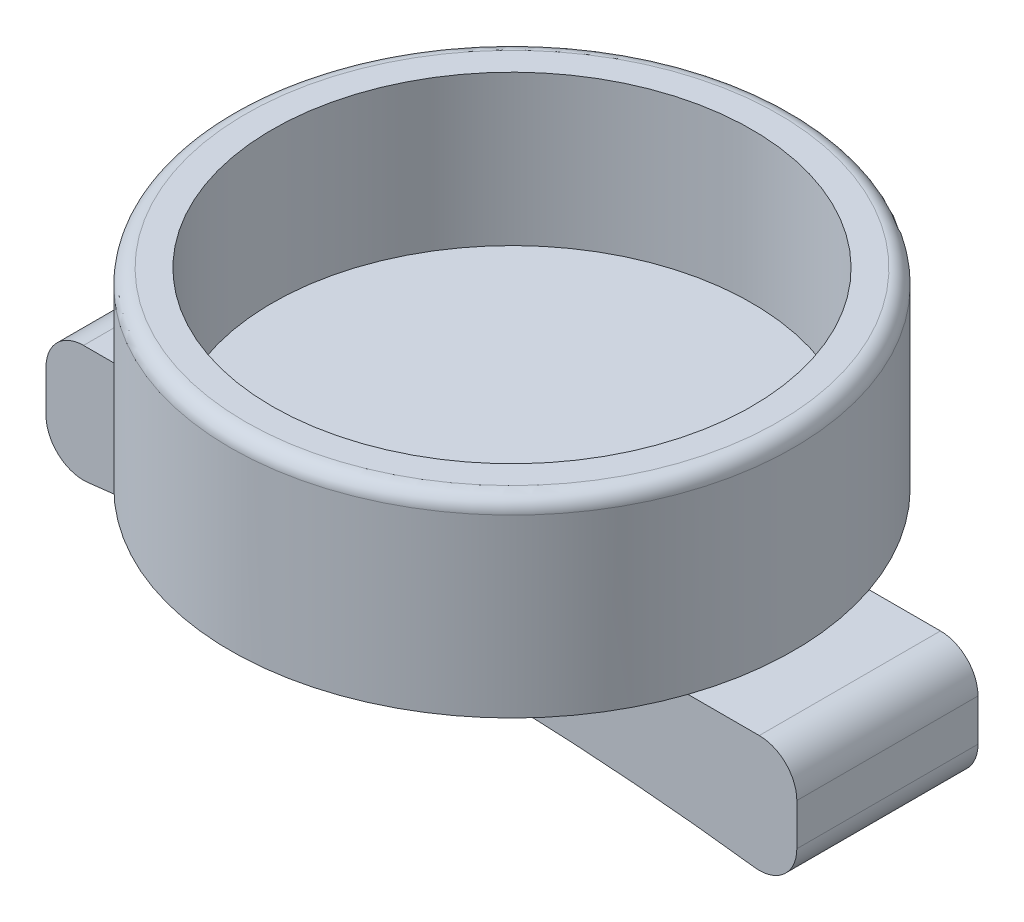
ISO-10303-21;
HEADER;
FILE_DESCRIPTION(('STEP AP214'),'2;1');
FILE_NAME('part.step','',(''),(''),'','','');
FILE_SCHEMA(('AUTOMOTIVE_DESIGN { 1 0 10303 214 1 1 1 1 }'));
ENDSEC;
DATA;
#1=APPLICATION_CONTEXT('core data for automotive mechanical design processes');
#2=APPLICATION_PROTOCOL_DEFINITION('international standard','automotive_design',2000,#1);
#3=PRODUCT_CONTEXT('',#1,'mechanical');
#4=PRODUCT('Part','Part','',(#3));
#5=PRODUCT_RELATED_PRODUCT_CATEGORY('part','',(#4));
#6=PRODUCT_DEFINITION_FORMATION('','',#4);
#7=PRODUCT_DEFINITION_CONTEXT('part definition',#1,'design');
#8=PRODUCT_DEFINITION('design','',#6,#7);
#9=PRODUCT_DEFINITION_SHAPE('','',#8);
#10=(LENGTH_UNIT() NAMED_UNIT(*) SI_UNIT(.MILLI.,.METRE.));
#11=(NAMED_UNIT(*) PLANE_ANGLE_UNIT() SI_UNIT($,.RADIAN.));
#12=(NAMED_UNIT(*) SI_UNIT($,.STERADIAN.) SOLID_ANGLE_UNIT());
#13=UNCERTAINTY_MEASURE_WITH_UNIT(LENGTH_MEASURE(1.E-05),#10,'distance_accuracy_value','');
#14=(GEOMETRIC_REPRESENTATION_CONTEXT(3) GLOBAL_UNCERTAINTY_ASSIGNED_CONTEXT((#13)) GLOBAL_UNIT_ASSIGNED_CONTEXT((#10,
#11,#12)) REPRESENTATION_CONTEXT('',''));
#15=CARTESIAN_POINT('',(0.,0.,0.));
#16=DIRECTION('',(0.,0.,1.));
#17=DIRECTION('',(1.,0.,0.));
#18=AXIS2_PLACEMENT_3D('',#15,#16,#17);
#19=CARTESIAN_POINT('',(0.,0.,2.413));
#20=DIRECTION('',(0.,0.,-1.));
#21=DIRECTION('',(-1.,0.,0.));
#22=AXIS2_PLACEMENT_3D('',#19,#20,#21);
#23=PLANE('',#22);
#24=CARTESIAN_POINT('',(-22.7137334488737,2.90967048638995,2.413));
#25=CARTESIAN_POINT('',(-21.755931286614,2.58714199098328,2.413));
#26=CARTESIAN_POINT('',(-20.7980778462307,2.26476496124619,2.413));
#27=CARTESIAN_POINT('',(-18.8792538706622,1.61965706366946,2.413));
#28=CARTESIAN_POINT('',(-17.9182826982644,1.29692809151747,2.413));
#29=CARTESIAN_POINT('',(-16.4437736747863,0.802546202921666,2.413));
#30=CARTESIAN_POINT('',(-15.9303498034586,0.630553417674674,2.413));
#31=CARTESIAN_POINT('',(-14.9033719246389,0.286932511774781,2.413));
#32=CARTESIAN_POINT('',(-14.3898179154052,0.115304396326443,2.413));
#33=CARTESIAN_POINT('',(-13.364155220285,-0.226917721989866,2.413));
#34=CARTESIAN_POINT('',(-12.8520470534466,-0.397513279934092,2.413));
#35=CARTESIAN_POINT('',(-11.827627104193,-0.738002495666409,2.413));
#36=CARTESIAN_POINT('',(-11.3153153338468,-0.907896189748109,2.413));
#37=CARTESIAN_POINT('',(-10.338599279968,-1.23072301561994,2.413));
#38=CARTESIAN_POINT('',(-9.87422512189183,-1.38374720389446,2.413));
#39=CARTESIAN_POINT('',(-8.94498208032934,-1.68858753628638,2.413));
#40=CARTESIAN_POINT('',(-8.48011311932927,-1.84040344423641,2.413));
#41=CARTESIAN_POINT('',(-7.54527677082481,-2.14357314596044,2.413));
#42=CARTESIAN_POINT('',(-7.07530336109038,-2.29490844130505,2.413));
#43=CARTESIAN_POINT('',(-6.369710028631,-2.51934930484679,2.413));
#44=CARTESIAN_POINT('',(-6.13448977949526,-2.59371013970404,2.413));
#45=CARTESIAN_POINT('',(-5.66369115748972,-2.74128805393398,2.413));
#46=CARTESIAN_POINT('',(-5.42811278609452,-2.81450513800222,2.413));
#47=CARTESIAN_POINT('',(-4.96686623918096,-2.95616436490684,2.413));
#48=CARTESIAN_POINT('',(-4.7412190630461,-3.02467470731523,2.413));
#49=CARTESIAN_POINT('',(-4.28931766296279,-3.1596552992677,2.413));
#50=CARTESIAN_POINT('',(-4.06306344975769,-3.22612558466109,2.413));
#51=CARTESIAN_POINT('',(-3.60902358989221,-3.35629130829126,2.413));
#52=CARTESIAN_POINT('',(-3.38123539011639,-3.41997791001711,2.413));
#53=CARTESIAN_POINT('',(-2.92441048730306,-3.54284143497381,2.413));
#54=CARTESIAN_POINT('',(-2.69537364971259,-3.60201786146824,2.413));
#55=CARTESIAN_POINT('',(-2.24005749159687,-3.71223133839901,2.413));
#56=CARTESIAN_POINT('',(-2.01381232453697,-3.76340538727789,2.413));
#57=CARTESIAN_POINT('',(-1.67280216760501,-3.8321080359036,2.413));
#58=CARTESIAN_POINT('',(-1.55885359035779,-3.85366657965055,2.413));
#59=CARTESIAN_POINT('',(-1.33036007146013,-3.89341751441553,2.413));
#60=CARTESIAN_POINT('',(-1.21581511404295,-3.91160981596948,2.413));
#61=CARTESIAN_POINT('',(-0.986888545797888,-3.94379052992712,2.413));
#62=CARTESIAN_POINT('',(-0.872510731079832,-3.95780555379537,2.413));
#63=CARTESIAN_POINT('',(-0.643279310200802,-3.98106674776154,2.413));
#64=CARTESIAN_POINT('',(-0.528425778128833,-3.99031363424318,2.413));
#65=CARTESIAN_POINT('',(-0.298482448574701,-4.00346240854396,2.413));
#66=CARTESIAN_POINT('',(-0.183392856714842,-4.00736781531629,2.413));
#67=CARTESIAN_POINT('',(0.046840066937026,-4.0095727133296,2.413));
#68=CARTESIAN_POINT('',(0.16198339812148,-4.00787226648322,2.413));
#69=CARTESIAN_POINT('',(0.389382945835056,-3.99909037228484,2.413));
#70=CARTESIAN_POINT('',(0.501644137690981,-3.99213474825159,2.413));
#71=CARTESIAN_POINT('',(0.725761030007553,-3.97342768470354,2.413));
#72=CARTESIAN_POINT('',(0.837616715553378,-3.96167607055847,2.413));
#73=CARTESIAN_POINT('',(1.17257762731816,-3.92015316079864,2.413));
#74=CARTESIAN_POINT('',(1.39490402853282,-3.8841222324034,2.413));
#75=CARTESIAN_POINT('',(1.83889791317842,-3.80046790514408,2.413));
#76=CARTESIAN_POINT('',(2.0605492235629,-3.75276318574789,2.413));
#77=CARTESIAN_POINT('',(2.50203848654343,-3.65003415340485,2.413));
#78=CARTESIAN_POINT('',(2.72187705136155,-3.5950124290053,2.413));
#79=CARTESIAN_POINT('',(3.16492025670042,-3.47901001963116,2.413));
#80=CARTESIAN_POINT('',(3.38809801795814,-3.41792807888983,2.413));
#81=CARTESIAN_POINT('',(3.83353905625117,-3.29249665439287,2.413));
#82=CARTESIAN_POINT('',(4.05580228758636,-3.22814700943946,2.413));
#83=CARTESIAN_POINT('',(4.49896139574724,-3.09742462557166,2.413));
#84=CARTESIAN_POINT('',(4.71985937306286,-3.03105897514001,2.413));
#85=CARTESIAN_POINT('',(5.16117262290718,-2.89676134874545,2.413));
#86=CARTESIAN_POINT('',(5.38158790487693,-2.82882940372282,2.413));
#87=CARTESIAN_POINT('',(5.83207718800281,-2.68871015685732,2.413));
#88=CARTESIAN_POINT('',(6.06213466218612,-2.61646981386599,2.413));
#89=CARTESIAN_POINT('',(6.52195810111018,-2.47106650431598,2.413));
#90=CARTESIAN_POINT('',(6.75172406508084,-2.3979035353255,2.413));
#91=CARTESIAN_POINT('',(7.44107226429194,-2.1772597056358,2.413));
#92=CARTESIAN_POINT('',(7.90032292451107,-2.0287436324766,2.413));
#93=CARTESIAN_POINT('',(8.81412510199966,-1.731400007019,2.413));
#94=CARTESIAN_POINT('',(9.26868151462657,-1.5825874524721,2.413));
#95=CARTESIAN_POINT('',(10.1774397803836,-1.28388202990367,2.413));
#96=CARTESIAN_POINT('',(10.6316416330151,-1.1339891603659,2.413));
#97=CARTESIAN_POINT('',(11.5850138140841,-0.818500585026312,2.413));
#98=CARTESIAN_POINT('',(12.0841584987104,-0.652827448838141,2.413));
#99=CARTESIAN_POINT('',(13.0822716727033,-0.320846760472825,2.413));
#100=CARTESIAN_POINT('',(13.5812401489903,-0.154539168990076,2.413));
#101=CARTESIAN_POINT('',(15.0808537911729,0.346026634625419,2.413));
#102=CARTESIAN_POINT('',(16.081275203279,0.680954991612116,2.413));
#103=CARTESIAN_POINT('',(18.0218015070006,1.33169069993779,2.413));
#104=CARTESIAN_POINT('',(18.9619258017048,1.64744024995831,2.413));
#105=CARTESIAN_POINT('',(20.8392949278039,2.27863285250425,2.413));
#106=CARTESIAN_POINT('',(21.7765403279972,2.59407421296093,2.413));
#107=CARTESIAN_POINT('',(22.7137334488737,2.90967048638995,2.413));
#108=B_SPLINE_CURVE_WITH_KNOTS('',3,(#24,#25,#26,#27,#28,#29,#30,#31,#32,#33,#34,#35,#36,#37,
#38,#39,#40,#41,#42,#43,#44,#45,#46,#47,#48,#49,#50,#51,#52,#53,#54,#55,#56,#57,#58,#59,#60,#61,
#62,#63,#64,#65,#66,#67,#68,#69,#70,#71,#72,#73,#74,#75,#76,#77,#78,#79,#80,#81,#82,#83,#84,#85,
#86,#87,#88,#89,#90,#91,#92,#93,#94,#95,#96,#97,#98,#99,#100,#101,#102,#103,#104,#105,#106,
#107),.UNSPECIFIED.,.F.,.F.,(4,2,2,2,2,2,2,2,2,2,2,2,2,2,2,2,2,2,2,2,2,2,2,2,2,2,2,2,2,2,2,2,2,
2,2,2,2,2,2,2,2,4),(0.,3.03194475618864,6.07309165187313,7.69748999329384,9.3219113644464,
10.9412376015683,12.560479027533,14.0272898892828,15.4943807363948,16.9755863759592,
17.7156673831237,18.4557453511755,19.1631937923228,19.8706297945631,20.5801688651187,
21.2897859694714,21.9854701968495,22.3333413523373,22.6812217518131,23.0268361223902,
23.3723985513639,23.7177332148565,24.0630640643867,24.400378883023,24.7377059849689,
25.4128773510045,26.0928930381366,26.7726687919698,27.4667911638684,28.1609478105586,
28.8528958078494,29.5448301482214,30.2682264587064,30.9916246762735,32.4396217050809,
33.8745071083458,35.309394525884,36.8871572737112,38.4650194076143,41.6300111513782,
44.6052056503395,47.5719190303954),.UNSPECIFIED.);
#109=CARTESIAN_POINT('',(-7.10122742911393,-2.286,2.413));
#110=VERTEX_POINT('',#109);
#111=CARTESIAN_POINT('',(7.10122742911393,-2.286,2.413));
#112=VERTEX_POINT('',#111);
#113=EDGE_CURVE('E61',#110,#112,#108,.T.);
#114=ORIENTED_EDGE('',*,*,#113,.F.);
#115=DIRECTION('',(1.,0.,0.));
#116=VECTOR('',#115,1.);
#117=CARTESIAN_POINT('',(0.,-2.286,2.413));
#118=LINE('',#117,#116);
#119=CARTESIAN_POINT('',(-8.99999918825691,-2.286,2.413));
#120=VERTEX_POINT('',#119);
#121=EDGE_CURVE('E127',#120,#110,#118,.T.);
#122=ORIENTED_EDGE('',*,*,#121,.F.);
#123=CARTESIAN_POINT('',(-8.99999918825692,-3.286,2.413));
#124=DIRECTION('',(0.,0.,-1.));
#125=DIRECTION('',(-1.,0.,0.));
#126=AXIS2_PLACEMENT_3D('',#123,#124,#125);
#127=CIRCLE('',#126,1.);
#128=CARTESIAN_POINT('',(-9.99999918825692,-3.28600000000001,2.413));
#129=VERTEX_POINT('',#128);
#130=EDGE_CURVE('E128',#129,#120,#127,.T.);
#131=ORIENTED_EDGE('',*,*,#130,.F.);
#132=DIRECTION('',(0.,-1.,0.));
#133=VECTOR('',#132,1.);
#134=CARTESIAN_POINT('',(-9.99999918825693,0.,2.413));
#135=LINE('',#134,#133);
#136=CARTESIAN_POINT('',(-9.99999918825692,-4.3981156557614,2.413));
#137=VERTEX_POINT('',#136);
#138=EDGE_CURVE('E210',#129,#137,#135,.T.);
#139=ORIENTED_EDGE('',*,*,#138,.T.);
#140=CARTESIAN_POINT('',(-8.99999918825692,-4.3981156557614,2.413));
#141=DIRECTION('',(0.,0.,-1.));
#142=DIRECTION('',(-1.,0.,0.));
#143=AXIS2_PLACEMENT_3D('',#140,#141,#142);
#144=CIRCLE('',#143,1.);
#145=CARTESIAN_POINT('',(-8.87337404936657,-5.39006629677183,2.413));
#146=VERTEX_POINT('',#145);
#147=EDGE_CURVE('E208',#137,#146,#144,.F.);
#148=ORIENTED_EDGE('',*,*,#147,.T.);
#149=CARTESIAN_POINT('',(0.,-74.9019274748038,2.413));
#150=DIRECTION('',(0.,0.,-1.));
#151=DIRECTION('',(-1.,0.,0.));
#152=AXIS2_PLACEMENT_3D('',#149,#150,#151);
#153=CIRCLE('',#152,70.0759274748038);
#154=CARTESIAN_POINT('',(8.87337404936658,-5.39006629677183,2.413));
#155=VERTEX_POINT('',#154);
#156=EDGE_CURVE('E205',#155,#146,#153,.F.);
#157=ORIENTED_EDGE('',*,*,#156,.F.);
#158=CARTESIAN_POINT('',(8.99999918825692,-4.3981156557614,2.413));
#159=DIRECTION('',(0.,0.,-1.));
#160=DIRECTION('',(-1.,0.,0.));
#161=AXIS2_PLACEMENT_3D('',#158,#159,#160);
#162=CIRCLE('',#161,0.999999999999999);
#163=CARTESIAN_POINT('',(9.99999918825692,-4.3981156557614,2.413));
#164=VERTEX_POINT('',#163);
#165=EDGE_CURVE('E218',#155,#164,#162,.F.);
#166=ORIENTED_EDGE('',*,*,#165,.T.);
#167=DIRECTION('',(0.,-1.,0.));
#168=VECTOR('',#167,1.);
#169=CARTESIAN_POINT('',(9.99999918825693,0.,2.413));
#170=LINE('',#169,#168);
#171=CARTESIAN_POINT('',(9.99999918825692,-3.28600000000001,2.413));
#172=VERTEX_POINT('',#171);
#173=EDGE_CURVE('E215',#172,#164,#170,.T.);
#174=ORIENTED_EDGE('',*,*,#173,.F.);
#175=CARTESIAN_POINT('',(8.99999918825692,-3.286,2.413));
#176=DIRECTION('',(0.,0.,-1.));
#177=DIRECTION('',(-1.,0.,0.));
#178=AXIS2_PLACEMENT_3D('',#175,#176,#177);
#179=CIRCLE('',#178,1.);
#180=CARTESIAN_POINT('',(8.99999918825691,-2.286,2.413));
#181=VERTEX_POINT('',#180);
#182=EDGE_CURVE('E123',#181,#172,#179,.T.);
#183=ORIENTED_EDGE('',*,*,#182,.F.);
#184=EDGE_CURVE('E119',#112,#181,#118,.T.);
#185=ORIENTED_EDGE('',*,*,#184,.F.);
#186=EDGE_LOOP('',(#114,#122,#131,#139,#148,#157,#166,#174,#183,#185));
#187=FACE_BOUND('',#186,.T.);
#188=ADVANCED_FACE('F37',(#187),#23,.F.);
#189=CARTESIAN_POINT('',(0.,0.,-2.413));
#190=DIRECTION('',(0.,0.,-1.));
#191=DIRECTION('',(-1.,0.,0.));
#192=AXIS2_PLACEMENT_3D('',#189,#190,#191);
#193=PLANE('',#192);
#194=DIRECTION('',(1.,0.,0.));
#195=VECTOR('',#194,1.);
#196=CARTESIAN_POINT('',(0.,-2.286,-2.413));
#197=LINE('',#196,#195);
#198=CARTESIAN_POINT('',(-8.99999918825691,-2.286,-2.413));
#199=VERTEX_POINT('',#198);
#200=CARTESIAN_POINT('',(-7.10122742911393,-2.286,-2.413));
#201=VERTEX_POINT('',#200);
#202=EDGE_CURVE('E187',#199,#201,#197,.T.);
#203=ORIENTED_EDGE('',*,*,#202,.T.);
#204=CARTESIAN_POINT('',(-22.7137334488737,2.90967048638995,-2.413));
#205=CARTESIAN_POINT('',(-21.755931286614,2.58714199098328,-2.413));
#206=CARTESIAN_POINT('',(-20.7980778462307,2.26476496124619,-2.413));
#207=CARTESIAN_POINT('',(-18.8792538706622,1.61965706366946,-2.413));
#208=CARTESIAN_POINT('',(-17.9182826982644,1.29692809151747,-2.413));
#209=CARTESIAN_POINT('',(-16.4437736747863,0.802546202921666,-2.413));
#210=CARTESIAN_POINT('',(-15.9303498034586,0.630553417674674,-2.413));
#211=CARTESIAN_POINT('',(-14.9033719246389,0.286932511774781,-2.413));
#212=CARTESIAN_POINT('',(-14.3898179154052,0.115304396326443,-2.413));
#213=CARTESIAN_POINT('',(-13.364155220285,-0.226917721989866,-2.413));
#214=CARTESIAN_POINT('',(-12.8520470534466,-0.397513279934092,-2.413));
#215=CARTESIAN_POINT('',(-11.827627104193,-0.738002495666409,-2.413));
#216=CARTESIAN_POINT('',(-11.3153153338468,-0.907896189748109,-2.413));
#217=CARTESIAN_POINT('',(-10.338599279968,-1.23072301561994,-2.413));
#218=CARTESIAN_POINT('',(-9.87422512189183,-1.38374720389446,-2.413));
#219=CARTESIAN_POINT('',(-8.94498208032934,-1.68858753628638,-2.413));
#220=CARTESIAN_POINT('',(-8.48011311932927,-1.84040344423641,-2.413));
#221=CARTESIAN_POINT('',(-7.54527677082481,-2.14357314596044,-2.413));
#222=CARTESIAN_POINT('',(-7.07530336109038,-2.29490844130505,-2.413));
#223=CARTESIAN_POINT('',(-6.369710028631,-2.51934930484679,-2.413));
#224=CARTESIAN_POINT('',(-6.13448977949526,-2.59371013970404,-2.413));
#225=CARTESIAN_POINT('',(-5.66369115748972,-2.74128805393398,-2.413));
#226=CARTESIAN_POINT('',(-5.42811278609452,-2.81450513800222,-2.413));
#227=CARTESIAN_POINT('',(-4.96686623918096,-2.95616436490684,-2.413));
#228=CARTESIAN_POINT('',(-4.7412190630461,-3.02467470731523,-2.413));
#229=CARTESIAN_POINT('',(-4.28931766296279,-3.1596552992677,-2.413));
#230=CARTESIAN_POINT('',(-4.06306344975769,-3.22612558466109,-2.413));
#231=CARTESIAN_POINT('',(-3.60902358989221,-3.35629130829126,-2.413));
#232=CARTESIAN_POINT('',(-3.38123539011639,-3.41997791001711,-2.413));
#233=CARTESIAN_POINT('',(-2.92441048730306,-3.54284143497381,-2.413));
#234=CARTESIAN_POINT('',(-2.69537364971259,-3.60201786146824,-2.413));
#235=CARTESIAN_POINT('',(-2.24005749159687,-3.71223133839901,-2.413));
#236=CARTESIAN_POINT('',(-2.01381232453697,-3.76340538727789,-2.413));
#237=CARTESIAN_POINT('',(-1.67280216760501,-3.8321080359036,-2.413));
#238=CARTESIAN_POINT('',(-1.55885359035779,-3.85366657965055,-2.413));
#239=CARTESIAN_POINT('',(-1.33036007146013,-3.89341751441553,-2.413));
#240=CARTESIAN_POINT('',(-1.21581511404295,-3.91160981596948,-2.413));
#241=CARTESIAN_POINT('',(-0.986888545797888,-3.94379052992712,-2.413));
#242=CARTESIAN_POINT('',(-0.872510731079832,-3.95780555379537,-2.413));
#243=CARTESIAN_POINT('',(-0.643279310200802,-3.98106674776154,-2.413));
#244=CARTESIAN_POINT('',(-0.528425778128833,-3.99031363424318,-2.413));
#245=CARTESIAN_POINT('',(-0.298482448574701,-4.00346240854396,-2.413));
#246=CARTESIAN_POINT('',(-0.183392856714842,-4.00736781531629,-2.413));
#247=CARTESIAN_POINT('',(0.046840066937026,-4.0095727133296,-2.413));
#248=CARTESIAN_POINT('',(0.16198339812148,-4.00787226648322,-2.413));
#249=CARTESIAN_POINT('',(0.389382945835056,-3.99909037228484,-2.413));
#250=CARTESIAN_POINT('',(0.501644137690981,-3.99213474825159,-2.413));
#251=CARTESIAN_POINT('',(0.725761030007553,-3.97342768470354,-2.413));
#252=CARTESIAN_POINT('',(0.837616715553378,-3.96167607055847,-2.413));
#253=CARTESIAN_POINT('',(1.17257762731816,-3.92015316079864,-2.413));
#254=CARTESIAN_POINT('',(1.39490402853282,-3.8841222324034,-2.413));
#255=CARTESIAN_POINT('',(1.83889791317842,-3.80046790514408,-2.413));
#256=CARTESIAN_POINT('',(2.0605492235629,-3.75276318574789,-2.413));
#257=CARTESIAN_POINT('',(2.50203848654343,-3.65003415340485,-2.413));
#258=CARTESIAN_POINT('',(2.72187705136155,-3.5950124290053,-2.413));
#259=CARTESIAN_POINT('',(3.16492025670042,-3.47901001963116,-2.413));
#260=CARTESIAN_POINT('',(3.38809801795814,-3.41792807888983,-2.413));
#261=CARTESIAN_POINT('',(3.83353905625117,-3.29249665439287,-2.413));
#262=CARTESIAN_POINT('',(4.05580228758636,-3.22814700943946,-2.413));
#263=CARTESIAN_POINT('',(4.49896139574724,-3.09742462557166,-2.413));
#264=CARTESIAN_POINT('',(4.71985937306286,-3.03105897514001,-2.413));
#265=CARTESIAN_POINT('',(5.16117262290718,-2.89676134874545,-2.413));
#266=CARTESIAN_POINT('',(5.38158790487693,-2.82882940372282,-2.413));
#267=CARTESIAN_POINT('',(5.83207718800281,-2.68871015685732,-2.413));
#268=CARTESIAN_POINT('',(6.06213466218612,-2.61646981386599,-2.413));
#269=CARTESIAN_POINT('',(6.52195810111018,-2.47106650431598,-2.413));
#270=CARTESIAN_POINT('',(6.75172406508084,-2.3979035353255,-2.413));
#271=CARTESIAN_POINT('',(7.44107226429194,-2.1772597056358,-2.413));
#272=CARTESIAN_POINT('',(7.90032292451107,-2.0287436324766,-2.413));
#273=CARTESIAN_POINT('',(8.81412510199966,-1.731400007019,-2.413));
#274=CARTESIAN_POINT('',(9.26868151462657,-1.5825874524721,-2.413));
#275=CARTESIAN_POINT('',(10.1774397803836,-1.28388202990367,-2.413));
#276=CARTESIAN_POINT('',(10.6316416330151,-1.1339891603659,-2.413));
#277=CARTESIAN_POINT('',(11.5850138140841,-0.818500585026312,-2.413));
#278=CARTESIAN_POINT('',(12.0841584987104,-0.652827448838141,-2.413));
#279=CARTESIAN_POINT('',(13.0822716727033,-0.320846760472825,-2.413));
#280=CARTESIAN_POINT('',(13.5812401489903,-0.154539168990076,-2.413));
#281=CARTESIAN_POINT('',(15.0808537911729,0.346026634625419,-2.413));
#282=CARTESIAN_POINT('',(16.081275203279,0.680954991612116,-2.413));
#283=CARTESIAN_POINT('',(18.0218015070006,1.33169069993779,-2.413));
#284=CARTESIAN_POINT('',(18.9619258017048,1.64744024995831,-2.413));
#285=CARTESIAN_POINT('',(20.8392949278039,2.27863285250425,-2.413));
#286=CARTESIAN_POINT('',(21.7765403279972,2.59407421296093,-2.413));
#287=CARTESIAN_POINT('',(22.7137334488737,2.90967048638995,-2.413));
#288=B_SPLINE_CURVE_WITH_KNOTS('',3,(#204,#205,#206,#207,#208,#209,#210,#211,#212,#213,#214,
#215,#216,#217,#218,#219,#220,#221,#222,#223,#224,#225,#226,#227,#228,#229,#230,#231,#232,#233,
#234,#235,#236,#237,#238,#239,#240,#241,#242,#243,#244,#245,#246,#247,#248,#249,#250,#251,#252,
#253,#254,#255,#256,#257,#258,#259,#260,#261,#262,#263,#264,#265,#266,#267,#268,#269,#270,#271,
#272,#273,#274,#275,#276,#277,#278,#279,#280,#281,#282,#283,#284,#285,#286,#287),.UNSPECIFIED.,
.F.,.F.,(4,2,2,2,2,2,2,2,2,2,2,2,2,2,2,2,2,2,2,2,2,2,2,2,2,2,2,2,2,2,2,2,2,2,2,2,2,2,2,2,2,4),
(0.,3.03194475618864,6.07309165187313,7.69748999329384,9.3219113644464,10.9412376015683,
12.560479027533,14.0272898892828,15.4943807363948,16.9755863759592,17.7156673831237,
18.4557453511755,19.1631937923228,19.8706297945631,20.5801688651187,21.2897859694714,
21.9854701968495,22.3333413523373,22.6812217518131,23.0268361223902,23.3723985513639,
23.7177332148565,24.0630640643867,24.400378883023,24.7377059849689,25.4128773510045,
26.0928930381366,26.7726687919698,27.4667911638684,28.1609478105586,28.8528958078494,
29.5448301482214,30.2682264587064,30.9916246762735,32.4396217050809,33.8745071083458,
35.309394525884,36.8871572737112,38.4650194076143,41.6300111513782,44.6052056503395,
47.5719190303954),.UNSPECIFIED.);
#289=CARTESIAN_POINT('',(7.10122742911393,-2.286,-2.413));
#290=VERTEX_POINT('',#289);
#291=EDGE_CURVE('E11',#201,#290,#288,.T.);
#292=ORIENTED_EDGE('',*,*,#291,.T.);
#293=CARTESIAN_POINT('',(8.99999918825691,-2.286,-2.413));
#294=VERTEX_POINT('',#293);
#295=EDGE_CURVE('E135',#290,#294,#197,.T.);
#296=ORIENTED_EDGE('',*,*,#295,.T.);
#297=CARTESIAN_POINT('',(8.99999918825692,-3.286,-2.413));
#298=DIRECTION('',(0.,0.,-1.));
#299=DIRECTION('',(-1.,0.,0.));
#300=AXIS2_PLACEMENT_3D('',#297,#298,#299);
#301=CIRCLE('',#300,1.);
#302=CARTESIAN_POINT('',(9.99999918825692,-3.28600000000001,-2.413));
#303=VERTEX_POINT('',#302);
#304=EDGE_CURVE('E192',#294,#303,#301,.T.);
#305=ORIENTED_EDGE('',*,*,#304,.T.);
#306=DIRECTION('',(0.,-1.,0.));
#307=VECTOR('',#306,1.);
#308=CARTESIAN_POINT('',(9.99999918825693,0.,-2.413));
#309=LINE('',#308,#307);
#310=CARTESIAN_POINT('',(9.99999918825692,-4.3981156557614,-2.413));
#311=VERTEX_POINT('',#310);
#312=EDGE_CURVE('E195',#303,#311,#309,.T.);
#313=ORIENTED_EDGE('',*,*,#312,.T.);
#314=CARTESIAN_POINT('',(8.99999918825692,-4.3981156557614,-2.413));
#315=DIRECTION('',(0.,0.,-1.));
#316=DIRECTION('',(-1.,0.,0.));
#317=AXIS2_PLACEMENT_3D('',#314,#315,#316);
#318=CIRCLE('',#317,0.999999999999999);
#319=CARTESIAN_POINT('',(8.87337404936658,-5.39006629677183,-2.413));
#320=VERTEX_POINT('',#319);
#321=EDGE_CURVE('E202',#320,#311,#318,.F.);
#322=ORIENTED_EDGE('',*,*,#321,.F.);
#323=CARTESIAN_POINT('',(0.,-74.9019274748038,-2.413));
#324=DIRECTION('',(0.,0.,-1.));
#325=DIRECTION('',(-1.,0.,0.));
#326=AXIS2_PLACEMENT_3D('',#323,#324,#325);
#327=CIRCLE('',#326,70.0759274748038);
#328=CARTESIAN_POINT('',(-8.87337404936657,-5.39006629677183,-2.413));
#329=VERTEX_POINT('',#328);
#330=EDGE_CURVE('E290',#320,#329,#327,.F.);
#331=ORIENTED_EDGE('',*,*,#330,.T.);
#332=CARTESIAN_POINT('',(-8.99999918825692,-4.3981156557614,-2.413));
#333=DIRECTION('',(0.,0.,-1.));
#334=DIRECTION('',(-1.,0.,0.));
#335=AXIS2_PLACEMENT_3D('',#332,#333,#334);
#336=CIRCLE('',#335,1.);
#337=CARTESIAN_POINT('',(-9.99999918825692,-4.3981156557614,-2.413));
#338=VERTEX_POINT('',#337);
#339=EDGE_CURVE('E294',#338,#329,#336,.F.);
#340=ORIENTED_EDGE('',*,*,#339,.F.);
#341=DIRECTION('',(0.,-1.,0.));
#342=VECTOR('',#341,1.);
#343=CARTESIAN_POINT('',(-9.99999918825693,0.,-2.413));
#344=LINE('',#343,#342);
#345=CARTESIAN_POINT('',(-9.99999918825692,-3.28600000000001,-2.413));
#346=VERTEX_POINT('',#345);
#347=EDGE_CURVE('E303',#346,#338,#344,.T.);
#348=ORIENTED_EDGE('',*,*,#347,.F.);
#349=CARTESIAN_POINT('',(-8.99999918825692,-3.286,-2.413));
#350=DIRECTION('',(0.,0.,-1.));
#351=DIRECTION('',(-1.,0.,0.));
#352=AXIS2_PLACEMENT_3D('',#349,#350,#351);
#353=CIRCLE('',#352,1.);
#354=EDGE_CURVE('E190',#346,#199,#353,.T.);
#355=ORIENTED_EDGE('',*,*,#354,.T.);
#356=EDGE_LOOP('',(#203,#292,#296,#305,#313,#322,#331,#340,#348,#355));
#357=FACE_BOUND('',#356,.T.);
#358=ADVANCED_FACE('F176',(#357),#193,.T.);
#359=CARTESIAN_POINT('',(0.,-1.206,0.));
#360=DIRECTION('',(0.,1.,0.));
#361=DIRECTION('',(0.,0.,1.));
#362=AXIS2_PLACEMENT_3D('',#359,#360,#361);
#363=CYLINDRICAL_SURFACE('',#362,6.3875);
#364=CARTESIAN_POINT('',(0.,-1.206,0.));
#365=DIRECTION('',(0.,1.,0.));
#366=DIRECTION('',(0.,0.,1.));
#367=AXIS2_PLACEMENT_3D('',#364,#365,#366);
#368=CIRCLE('',#367,6.3875);
#369=CARTESIAN_POINT('',(0.,-1.206,6.3875));
#370=VERTEX_POINT('',#369);
#371=EDGE_CURVE('E152',#370,#370,#368,.T.);
#372=ORIENTED_EDGE('',*,*,#371,.F.);
#373=EDGE_LOOP('',(#372));
#374=FACE_BOUND('',#373,.T.);
#375=CARTESIAN_POINT('',(0.,2.794,0.));
#376=DIRECTION('',(0.,1.,0.));
#377=DIRECTION('',(0.,0.,1.));
#378=AXIS2_PLACEMENT_3D('',#375,#376,#377);
#379=CIRCLE('',#378,6.3875);
#380=CARTESIAN_POINT('',(0.,2.794,6.3875));
#381=VERTEX_POINT('',#380);
#382=EDGE_CURVE('E149',#381,#381,#379,.T.);
#383=ORIENTED_EDGE('',*,*,#382,.T.);
#384=EDGE_LOOP('',(#383));
#385=FACE_BOUND('',#384,.T.);
#386=ADVANCED_FACE('F173',(#374,#385),#363,.F.);
#387=CARTESIAN_POINT('',(0.,-1.206,0.));
#388=DIRECTION('',(0.,1.,0.));
#389=DIRECTION('',(0.,0.,1.));
#390=AXIS2_PLACEMENT_3D('',#387,#388,#389);
#391=PLANE('',#390);
#392=ORIENTED_EDGE('',*,*,#371,.T.);
#393=EDGE_LOOP('',(#392));
#394=FACE_BOUND('',#393,.T.);
#395=ADVANCED_FACE('F168',(#394),#391,.T.);
#396=CARTESIAN_POINT('',(0.,2.794,0.));
#397=DIRECTION('',(0.,1.,0.));
#398=DIRECTION('',(0.,0.,1.));
#399=AXIS2_PLACEMENT_3D('',#396,#397,#398);
#400=PLANE('',#399);
#401=ORIENTED_EDGE('',*,*,#382,.F.);
#402=EDGE_LOOP('',(#401));
#403=FACE_BOUND('',#402,.T.);
#404=CARTESIAN_POINT('',(0.,2.794,0.));
#405=DIRECTION('',(0.,1.,0.));
#406=DIRECTION('',(0.,0.,1.));
#407=AXIS2_PLACEMENT_3D('',#404,#405,#406);
#408=CIRCLE('',#407,7.1);
#409=CARTESIAN_POINT('',(0.,2.794,7.1));
#410=VERTEX_POINT('',#409);
#411=EDGE_CURVE('E138',#410,#410,#408,.T.);
#412=ORIENTED_EDGE('',*,*,#411,.T.);
#413=EDGE_LOOP('',(#412));
#414=FACE_BOUND('',#413,.T.);
#415=ADVANCED_FACE('F172',(#403,#414),#400,.T.);
#416=CARTESIAN_POINT('',(0.,2.794,0.));
#417=DIRECTION('',(0.,-1.,0.));
#418=DIRECTION('',(0.,0.,-1.));
#419=AXIS2_PLACEMENT_3D('',#416,#417,#418);
#420=CYLINDRICAL_SURFACE('',#419,7.5);
#421=CARTESIAN_POINT('',(0.,2.394,0.));
#422=DIRECTION('',(0.,1.,0.));
#423=DIRECTION('',(0.,0.,1.));
#424=AXIS2_PLACEMENT_3D('',#421,#422,#423);
#425=CIRCLE('',#424,7.5);
#426=CARTESIAN_POINT('',(0.,2.394,7.5));
#427=VERTEX_POINT('',#426);
#428=EDGE_CURVE('E51',#427,#427,#425,.F.);
#429=ORIENTED_EDGE('',*,*,#428,.T.);
#430=EDGE_LOOP('',(#429));
#431=FACE_BOUND('',#430,.T.);
#432=CARTESIAN_POINT('',(0.,-2.286,0.));
#433=DIRECTION('',(0.,-1.,0.));
#434=DIRECTION('',(0.,0.,-1.));
#435=AXIS2_PLACEMENT_3D('',#432,#433,#434);
#436=CIRCLE('',#435,7.5);
#437=EDGE_CURVE('E132',#290,#112,#436,.T.);
#438=ORIENTED_EDGE('',*,*,#437,.F.);
#439=EDGE_CURVE('E141',#201,#290,#436,.T.);
#440=ORIENTED_EDGE('',*,*,#439,.F.);
#441=CARTESIAN_POINT('',(0.,-2.286,0.));
#442=DIRECTION('',(0.,1.,0.));
#443=DIRECTION('',(-1.,0.,0.));
#444=AXIS2_PLACEMENT_3D('',#441,#442,#443);
#445=CIRCLE('',#444,7.5);
#446=EDGE_CURVE('E145',#201,#110,#445,.T.);
#447=ORIENTED_EDGE('',*,*,#446,.T.);
#448=EDGE_CURVE('E139',#112,#110,#436,.T.);
#449=ORIENTED_EDGE('',*,*,#448,.F.);
#450=EDGE_LOOP('',(#438,#440,#447,#449));
#451=FACE_BOUND('',#450,.T.);
#452=ADVANCED_FACE('F143',(#431,#451),#420,.T.);
#453=CARTESIAN_POINT('',(0.,2.394,0.));
#454=DIRECTION('',(0.,1.,0.));
#455=DIRECTION('',(0.,0.,1.));
#456=AXIS2_PLACEMENT_3D('',#453,#454,#455);
#457=TOROIDAL_SURFACE('',#456,7.1,0.4);
#458=ORIENTED_EDGE('',*,*,#428,.F.);
#459=EDGE_LOOP('',(#458));
#460=FACE_BOUND('',#459,.T.);
#461=ORIENTED_EDGE('',*,*,#411,.F.);
#462=EDGE_LOOP('',(#461));
#463=FACE_BOUND('',#462,.T.);
#464=ADVANCED_FACE('F39',(#460,#463),#457,.T.);
#465=CARTESIAN_POINT('',(0.,-2.286,2.413));
#466=DIRECTION('',(0.,1.,0.));
#467=DIRECTION('',(-1.,0.,0.));
#468=AXIS2_PLACEMENT_3D('',#465,#466,#467);
#469=PLANE('',#468);
#470=ORIENTED_EDGE('',*,*,#437,.T.);
#471=ORIENTED_EDGE('',*,*,#184,.T.);
#472=DIRECTION('',(0.,0.,-1.));
#473=VECTOR('',#472,1.);
#474=CARTESIAN_POINT('',(8.99999918825691,-2.286,2.413));
#475=LINE('',#474,#473);
#476=EDGE_CURVE('E227',#181,#294,#475,.T.);
#477=ORIENTED_EDGE('',*,*,#476,.T.);
#478=ORIENTED_EDGE('',*,*,#295,.F.);
#479=EDGE_LOOP('',(#470,#471,#477,#478));
#480=FACE_BOUND('',#479,.T.);
#481=ADVANCED_FACE('F134',(#480),#469,.T.);
#482=ORIENTED_EDGE('',*,*,#446,.F.);
#483=ORIENTED_EDGE('',*,*,#202,.F.);
#484=DIRECTION('',(0.,0.,-1.));
#485=VECTOR('',#484,1.);
#486=CARTESIAN_POINT('',(-8.99999918825691,-2.286,2.413));
#487=LINE('',#486,#485);
#488=EDGE_CURVE('E229',#120,#199,#487,.T.);
#489=ORIENTED_EDGE('',*,*,#488,.F.);
#490=ORIENTED_EDGE('',*,*,#121,.T.);
#491=EDGE_LOOP('',(#482,#483,#489,#490));
#492=FACE_BOUND('',#491,.T.);
#493=ADVANCED_FACE('F258',(#492),#469,.T.);
#494=CARTESIAN_POINT('',(0.,-74.9019274748038,2.413));
#495=DIRECTION('',(0.,0.,-1.));
#496=DIRECTION('',(-1.,0.,0.));
#497=AXIS2_PLACEMENT_3D('',#494,#495,#496);
#498=CYLINDRICAL_SURFACE('',#497,70.0759274748038);
#499=CARTESIAN_POINT('',(0.,-4.82600000000001,0.));
#500=VERTEX_POINT('',#499);
#501=VERTEX_LOOP('',#500);
#502=FACE_BOUND('',#501,.T.);
#503=DIRECTION('',(0.,0.,-1.));
#504=VECTOR('',#503,1.);
#505=CARTESIAN_POINT('',(-8.87337404936657,-5.39006629677183,2.413));
#506=LINE('',#505,#504);
#507=EDGE_CURVE('E220',#146,#329,#506,.T.);
#508=ORIENTED_EDGE('',*,*,#507,.T.);
#509=ORIENTED_EDGE('',*,*,#330,.F.);
#510=DIRECTION('',(0.,0.,-1.));
#511=VECTOR('',#510,1.);
#512=CARTESIAN_POINT('',(8.87337404936658,-5.39006629677183,2.413));
#513=LINE('',#512,#511);
#514=EDGE_CURVE('E221',#155,#320,#513,.T.);
#515=ORIENTED_EDGE('',*,*,#514,.F.);
#516=ORIENTED_EDGE('',*,*,#156,.T.);
#517=EDGE_LOOP('',(#508,#509,#515,#516));
#518=FACE_BOUND('',#517,.T.);
#519=ADVANCED_FACE('F254',(#502,#518),#498,.F.);
#520=CARTESIAN_POINT('',(8.99999918825692,-4.3981156557614,2.413));
#521=DIRECTION('',(0.,0.,-1.));
#522=DIRECTION('',(-1.,0.,0.));
#523=AXIS2_PLACEMENT_3D('',#520,#521,#522);
#524=CYLINDRICAL_SURFACE('',#523,0.999999999999999);
#525=ORIENTED_EDGE('',*,*,#514,.T.);
#526=ORIENTED_EDGE('',*,*,#321,.T.);
#527=DIRECTION('',(0.,0.,-1.));
#528=VECTOR('',#527,1.);
#529=CARTESIAN_POINT('',(9.99999918825692,-4.3981156557614,2.413));
#530=LINE('',#529,#528);
#531=EDGE_CURVE('E223',#164,#311,#530,.T.);
#532=ORIENTED_EDGE('',*,*,#531,.F.);
#533=ORIENTED_EDGE('',*,*,#165,.F.);
#534=EDGE_LOOP('',(#525,#526,#532,#533));
#535=FACE_BOUND('',#534,.T.);
#536=ADVANCED_FACE('F257',(#535),#524,.T.);
#537=CARTESIAN_POINT('',(9.99999918825693,0.,2.413));
#538=DIRECTION('',(1.,0.,0.));
#539=DIRECTION('',(0.,1.,0.));
#540=AXIS2_PLACEMENT_3D('',#537,#538,#539);
#541=PLANE('',#540);
#542=ORIENTED_EDGE('',*,*,#531,.T.);
#543=ORIENTED_EDGE('',*,*,#312,.F.);
#544=DIRECTION('',(0.,0.,-1.));
#545=VECTOR('',#544,1.);
#546=CARTESIAN_POINT('',(9.99999918825692,-3.28600000000001,2.413));
#547=LINE('',#546,#545);
#548=EDGE_CURVE('E225',#172,#303,#547,.T.);
#549=ORIENTED_EDGE('',*,*,#548,.F.);
#550=ORIENTED_EDGE('',*,*,#173,.T.);
#551=EDGE_LOOP('',(#542,#543,#549,#550));
#552=FACE_BOUND('',#551,.T.);
#553=ADVANCED_FACE('F275',(#552),#541,.T.);
#554=CARTESIAN_POINT('',(8.99999918825692,-3.286,2.413));
#555=DIRECTION('',(0.,0.,-1.));
#556=DIRECTION('',(-1.,0.,0.));
#557=AXIS2_PLACEMENT_3D('',#554,#555,#556);
#558=CYLINDRICAL_SURFACE('',#557,1.);
#559=ORIENTED_EDGE('',*,*,#548,.T.);
#560=ORIENTED_EDGE('',*,*,#304,.F.);
#561=ORIENTED_EDGE('',*,*,#476,.F.);
#562=ORIENTED_EDGE('',*,*,#182,.T.);
#563=EDGE_LOOP('',(#559,#560,#561,#562));
#564=FACE_BOUND('',#563,.T.);
#565=ADVANCED_FACE('F269',(#564),#558,.T.);
#566=CARTESIAN_POINT('',(-8.99999918825692,-3.286,2.413));
#567=DIRECTION('',(0.,0.,-1.));
#568=DIRECTION('',(-1.,0.,0.));
#569=AXIS2_PLACEMENT_3D('',#566,#567,#568);
#570=CYLINDRICAL_SURFACE('',#569,1.);
#571=ORIENTED_EDGE('',*,*,#488,.T.);
#572=ORIENTED_EDGE('',*,*,#354,.F.);
#573=DIRECTION('',(0.,0.,-1.));
#574=VECTOR('',#573,1.);
#575=CARTESIAN_POINT('',(-9.99999918825692,-3.28600000000001,2.413));
#576=LINE('',#575,#574);
#577=EDGE_CURVE('E231',#129,#346,#576,.T.);
#578=ORIENTED_EDGE('',*,*,#577,.F.);
#579=ORIENTED_EDGE('',*,*,#130,.T.);
#580=EDGE_LOOP('',(#571,#572,#578,#579));
#581=FACE_BOUND('',#580,.T.);
#582=ADVANCED_FACE('F265',(#581),#570,.T.);
#583=CARTESIAN_POINT('',(-9.99999918825693,0.,2.413));
#584=DIRECTION('',(1.,0.,0.));
#585=DIRECTION('',(0.,1.,0.));
#586=AXIS2_PLACEMENT_3D('',#583,#584,#585);
#587=PLANE('',#586);
#588=ORIENTED_EDGE('',*,*,#577,.T.);
#589=ORIENTED_EDGE('',*,*,#347,.T.);
#590=DIRECTION('',(0.,0.,-1.));
#591=VECTOR('',#590,1.);
#592=CARTESIAN_POINT('',(-9.99999918825692,-4.3981156557614,2.413));
#593=LINE('',#592,#591);
#594=EDGE_CURVE('E233',#137,#338,#593,.T.);
#595=ORIENTED_EDGE('',*,*,#594,.F.);
#596=ORIENTED_EDGE('',*,*,#138,.F.);
#597=EDGE_LOOP('',(#588,#589,#595,#596));
#598=FACE_BOUND('',#597,.T.);
#599=ADVANCED_FACE('F261',(#598),#587,.F.);
#600=CARTESIAN_POINT('',(-8.99999918825692,-4.3981156557614,2.413));
#601=DIRECTION('',(0.,0.,-1.));
#602=DIRECTION('',(-1.,0.,0.));
#603=AXIS2_PLACEMENT_3D('',#600,#601,#602);
#604=CYLINDRICAL_SURFACE('',#603,1.);
#605=ORIENTED_EDGE('',*,*,#594,.T.);
#606=ORIENTED_EDGE('',*,*,#339,.T.);
#607=ORIENTED_EDGE('',*,*,#507,.F.);
#608=ORIENTED_EDGE('',*,*,#147,.F.);
#609=EDGE_LOOP('',(#605,#606,#607,#608));
#610=FACE_BOUND('',#609,.T.);
#611=ADVANCED_FACE('F166',(#610),#604,.T.);
#612=CARTESIAN_POINT('',(0.,-2.286,0.));
#613=DIRECTION('',(0.,1.,0.));
#614=DIRECTION('',(0.,0.,1.));
#615=AXIS2_PLACEMENT_3D('',#612,#613,#614);
#616=CONICAL_SURFACE('',#615,7.5,1.24425347681699);
#617=ORIENTED_EDGE('',*,*,#291,.F.);
#618=ORIENTED_EDGE('',*,*,#439,.T.);
#619=EDGE_LOOP('',(#617,#618));
#620=FACE_BOUND('',#619,.T.);
#621=ADVANCED_FACE('F162',(#620),#616,.T.);
#622=ORIENTED_EDGE('',*,*,#448,.T.);
#623=ORIENTED_EDGE('',*,*,#113,.T.);
#624=EDGE_LOOP('',(#622,#623));
#625=FACE_BOUND('',#624,.T.);
#626=ADVANCED_FACE('F148',(#625),#616,.T.);
#627=CLOSED_SHELL('',(#188,#358,#386,#395,#415,#452,#464,#481,#493,#519,#536,#553,#565,#582,
#599,#611,#621,#626));
#628=MANIFOLD_SOLID_BREP('B2',#627);
#629=ADVANCED_BREP_SHAPE_REPRESENTATION('',(#18,#628),#14);
#630=SHAPE_DEFINITION_REPRESENTATION(#9,#629);
ENDSEC;
END-ISO-10303-21;
